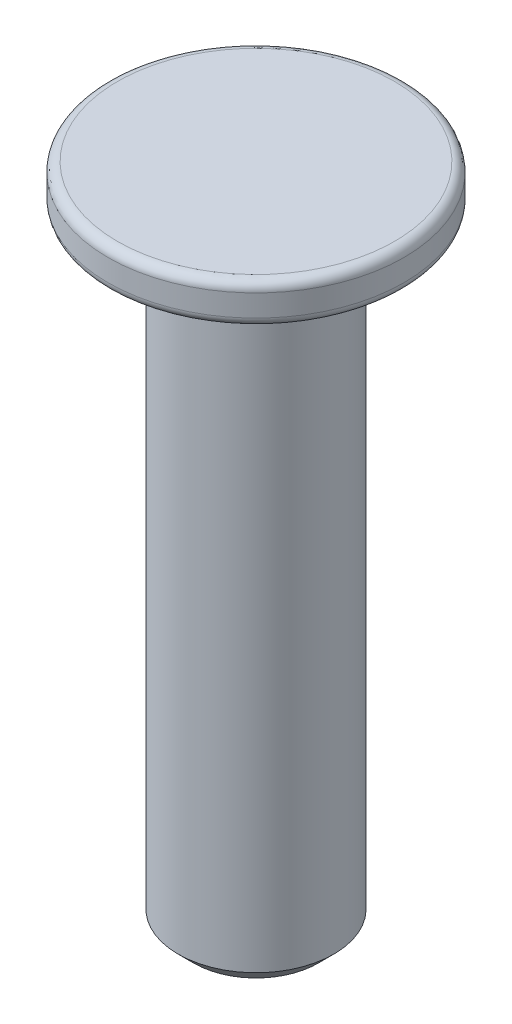
ISO-10303-21;
HEADER;
FILE_DESCRIPTION(('STEP AP214'),'2;1');
FILE_NAME('part.step','',(''),(''),'','','');
FILE_SCHEMA(('AUTOMOTIVE_DESIGN { 1 0 10303 214 1 1 1 1 }'));
ENDSEC;
DATA;
#1=APPLICATION_CONTEXT('core data for automotive mechanical design processes');
#2=APPLICATION_PROTOCOL_DEFINITION('international standard','automotive_design',2000,#1);
#3=PRODUCT_CONTEXT('',#1,'mechanical');
#4=PRODUCT('Part','Part','',(#3));
#5=PRODUCT_RELATED_PRODUCT_CATEGORY('part','',(#4));
#6=PRODUCT_DEFINITION_FORMATION('','',#4);
#7=PRODUCT_DEFINITION_CONTEXT('part definition',#1,'design');
#8=PRODUCT_DEFINITION('design','',#6,#7);
#9=PRODUCT_DEFINITION_SHAPE('','',#8);
#10=(LENGTH_UNIT() NAMED_UNIT(*) SI_UNIT(.MILLI.,.METRE.));
#11=(NAMED_UNIT(*) PLANE_ANGLE_UNIT() SI_UNIT($,.RADIAN.));
#12=(NAMED_UNIT(*) SI_UNIT($,.STERADIAN.) SOLID_ANGLE_UNIT());
#13=UNCERTAINTY_MEASURE_WITH_UNIT(LENGTH_MEASURE(1.E-05),#10,'distance_accuracy_value','');
#14=(GEOMETRIC_REPRESENTATION_CONTEXT(3) GLOBAL_UNCERTAINTY_ASSIGNED_CONTEXT((#13)) GLOBAL_UNIT_ASSIGNED_CONTEXT((#10,
#11,#12)) REPRESENTATION_CONTEXT('',''));
#15=CARTESIAN_POINT('',(0.,0.,0.));
#16=DIRECTION('',(0.,0.,1.));
#17=DIRECTION('',(1.,0.,0.));
#18=AXIS2_PLACEMENT_3D('',#15,#16,#17);
#19=CARTESIAN_POINT('',(0.,20.,0.));
#20=DIRECTION('',(0.,-1.,0.));
#21=DIRECTION('',(0.,0.,-1.));
#22=AXIS2_PLACEMENT_3D('',#19,#20,#21);
#23=CYLINDRICAL_SURFACE('',#22,2.5);
#24=CARTESIAN_POINT('',(0.,0.5,0.));
#25=DIRECTION('',(0.,1.,0.));
#26=DIRECTION('',(0.,0.,1.));
#27=AXIS2_PLACEMENT_3D('',#24,#25,#26);
#28=CIRCLE('',#27,2.5);
#29=CARTESIAN_POINT('',(0.,0.5,2.5));
#30=VERTEX_POINT('',#29);
#31=EDGE_CURVE('E47',#30,#30,#28,.T.);
#32=ORIENTED_EDGE('',*,*,#31,.T.);
#33=EDGE_LOOP('',(#32));
#34=FACE_BOUND('',#33,.T.);
#35=CARTESIAN_POINT('',(0.,20.,0.));
#36=DIRECTION('',(0.,1.,0.));
#37=DIRECTION('',(0.,0.,1.));
#38=AXIS2_PLACEMENT_3D('',#35,#36,#37);
#39=CIRCLE('',#38,2.5);
#40=CARTESIAN_POINT('',(0.,20.,2.5));
#41=VERTEX_POINT('',#40);
#42=EDGE_CURVE('E70',#41,#41,#39,.T.);
#43=ORIENTED_EDGE('',*,*,#42,.F.);
#44=EDGE_LOOP('',(#43));
#45=FACE_BOUND('',#44,.T.);
#46=ADVANCED_FACE('F41',(#34,#45),#23,.T.);
#47=CARTESIAN_POINT('',(0.,0.,0.));
#48=DIRECTION('',(0.,1.,0.));
#49=DIRECTION('',(0.,0.,1.));
#50=AXIS2_PLACEMENT_3D('',#47,#48,#49);
#51=PLANE('',#50);
#52=CARTESIAN_POINT('',(0.,0.,0.));
#53=DIRECTION('',(0.,1.,0.));
#54=DIRECTION('',(0.,0.,1.));
#55=AXIS2_PLACEMENT_3D('',#52,#53,#54);
#56=CIRCLE('',#55,2.);
#57=CARTESIAN_POINT('',(0.,0.,2.));
#58=VERTEX_POINT('',#57);
#59=EDGE_CURVE('E10',#58,#58,#56,.F.);
#60=ORIENTED_EDGE('',*,*,#59,.T.);
#61=EDGE_LOOP('',(#60));
#62=FACE_BOUND('',#61,.T.);
#63=ADVANCED_FACE('F73',(#62),#51,.F.);
#64=CARTESIAN_POINT('',(0.,21.3,0.));
#65=DIRECTION('',(0.,-1.,0.));
#66=DIRECTION('',(0.,0.,-1.));
#67=AXIS2_PLACEMENT_3D('',#64,#65,#66);
#68=CYLINDRICAL_SURFACE('',#67,4.75);
#69=CARTESIAN_POINT('',(0.,20.3,0.));
#70=DIRECTION('',(0.,1.,0.));
#71=DIRECTION('',(0.,0.,1.));
#72=AXIS2_PLACEMENT_3D('',#69,#70,#71);
#73=CIRCLE('',#72,4.75);
#74=CARTESIAN_POINT('',(0.,20.3,4.75));
#75=VERTEX_POINT('',#74);
#76=EDGE_CURVE('E62',#75,#75,#73,.T.);
#77=ORIENTED_EDGE('',*,*,#76,.T.);
#78=EDGE_LOOP('',(#77));
#79=FACE_BOUND('',#78,.T.);
#80=CARTESIAN_POINT('',(0.,21.,0.));
#81=DIRECTION('',(0.,1.,0.));
#82=DIRECTION('',(0.,0.,1.));
#83=AXIS2_PLACEMENT_3D('',#80,#81,#82);
#84=CIRCLE('',#83,4.75);
#85=CARTESIAN_POINT('',(0.,21.,4.75));
#86=VERTEX_POINT('',#85);
#87=EDGE_CURVE('E65',#86,#86,#84,.F.);
#88=ORIENTED_EDGE('',*,*,#87,.T.);
#89=EDGE_LOOP('',(#88));
#90=FACE_BOUND('',#89,.T.);
#91=ADVANCED_FACE('F80',(#79,#90),#68,.T.);
#92=CARTESIAN_POINT('',(0.,21.3,0.));
#93=DIRECTION('',(0.,1.,0.));
#94=DIRECTION('',(0.,0.,1.));
#95=AXIS2_PLACEMENT_3D('',#92,#93,#94);
#96=PLANE('',#95);
#97=CARTESIAN_POINT('',(0.,21.3,0.));
#98=DIRECTION('',(0.,1.,0.));
#99=DIRECTION('',(0.,0.,1.));
#100=AXIS2_PLACEMENT_3D('',#97,#98,#99);
#101=CIRCLE('',#100,4.45);
#102=CARTESIAN_POINT('',(0.,21.3,4.45));
#103=VERTEX_POINT('',#102);
#104=EDGE_CURVE('E52',#103,#103,#101,.T.);
#105=ORIENTED_EDGE('',*,*,#104,.T.);
#106=EDGE_LOOP('',(#105));
#107=FACE_BOUND('',#106,.T.);
#108=ADVANCED_FACE('F98',(#107),#96,.T.);
#109=CARTESIAN_POINT('',(0.,20.,0.));
#110=DIRECTION('',(0.,1.,0.));
#111=DIRECTION('',(0.,0.,1.));
#112=AXIS2_PLACEMENT_3D('',#109,#110,#111);
#113=PLANE('',#112);
#114=CARTESIAN_POINT('',(0.,20.,0.));
#115=DIRECTION('',(0.,1.,0.));
#116=DIRECTION('',(0.,0.,1.));
#117=AXIS2_PLACEMENT_3D('',#114,#115,#116);
#118=CIRCLE('',#117,4.45);
#119=CARTESIAN_POINT('',(0.,20.,4.45));
#120=VERTEX_POINT('',#119);
#121=EDGE_CURVE('E60',#120,#120,#118,.F.);
#122=ORIENTED_EDGE('',*,*,#121,.T.);
#123=EDGE_LOOP('',(#122));
#124=FACE_BOUND('',#123,.T.);
#125=ORIENTED_EDGE('',*,*,#42,.T.);
#126=EDGE_LOOP('',(#125));
#127=FACE_BOUND('',#126,.T.);
#128=ADVANCED_FACE('F75',(#124,#127),#113,.F.);
#129=CARTESIAN_POINT('',(0.,20.3,0.));
#130=DIRECTION('',(0.,1.,0.));
#131=DIRECTION('',(0.,0.,1.));
#132=AXIS2_PLACEMENT_3D('',#129,#130,#131);
#133=TOROIDAL_SURFACE('',#132,4.45,0.3);
#134=ORIENTED_EDGE('',*,*,#121,.F.);
#135=EDGE_LOOP('',(#134));
#136=FACE_BOUND('',#135,.T.);
#137=ORIENTED_EDGE('',*,*,#76,.F.);
#138=EDGE_LOOP('',(#137));
#139=FACE_BOUND('',#138,.T.);
#140=ADVANCED_FACE('F83',(#136,#139),#133,.T.);
#141=CARTESIAN_POINT('',(0.,21.,0.));
#142=DIRECTION('',(0.,1.,0.));
#143=DIRECTION('',(0.,0.,1.));
#144=AXIS2_PLACEMENT_3D('',#141,#142,#143);
#145=TOROIDAL_SURFACE('',#144,4.45,0.3);
#146=ORIENTED_EDGE('',*,*,#87,.F.);
#147=EDGE_LOOP('',(#146));
#148=FACE_BOUND('',#147,.T.);
#149=ORIENTED_EDGE('',*,*,#104,.F.);
#150=EDGE_LOOP('',(#149));
#151=FACE_BOUND('',#150,.T.);
#152=ADVANCED_FACE('F88',(#148,#151),#145,.T.);
#153=CARTESIAN_POINT('',(0.,0.5,0.));
#154=DIRECTION('',(0.,1.,0.));
#155=DIRECTION('',(0.,0.,1.));
#156=AXIS2_PLACEMENT_3D('',#153,#154,#155);
#157=CONICAL_SURFACE('',#156,2.5,0.78539816339745);
#158=ORIENTED_EDGE('',*,*,#59,.F.);
#159=EDGE_LOOP('',(#158));
#160=FACE_BOUND('',#159,.T.);
#161=ORIENTED_EDGE('',*,*,#31,.F.);
#162=EDGE_LOOP('',(#161));
#163=FACE_BOUND('',#162,.T.);
#164=ADVANCED_FACE('F42',(#160,#163),#157,.T.);
#165=CLOSED_SHELL('',(#46,#63,#91,#108,#128,#140,#152,#164));
#166=MANIFOLD_SOLID_BREP('B2',#165);
#167=ADVANCED_BREP_SHAPE_REPRESENTATION('',(#18,#166),#14);
#168=SHAPE_DEFINITION_REPRESENTATION(#9,#167);
ENDSEC;
END-ISO-10303-21;
